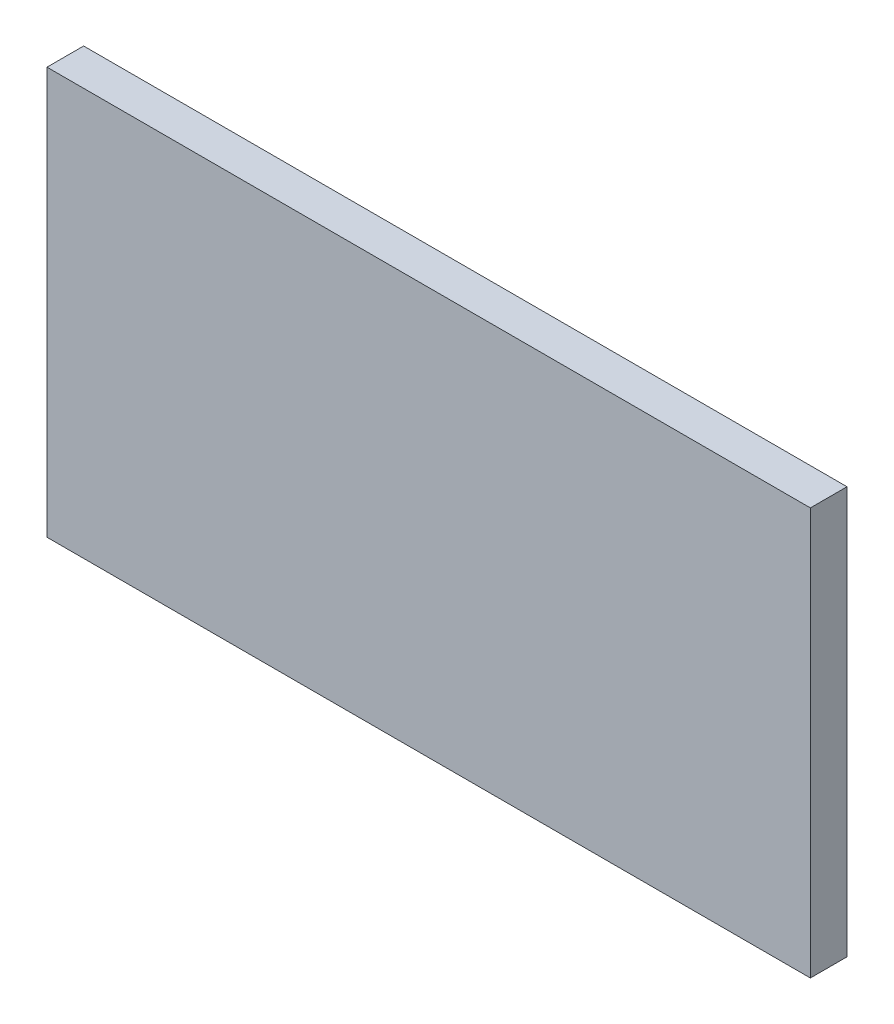
ISO-10303-21;
HEADER;
FILE_DESCRIPTION(('STEP AP214'),'2;1');
FILE_NAME('part.step','',(''),(''),'','','');
FILE_SCHEMA(('AUTOMOTIVE_DESIGN { 1 0 10303 214 1 1 1 1 }'));
ENDSEC;
DATA;
#1=APPLICATION_CONTEXT('core data for automotive mechanical design processes');
#2=APPLICATION_PROTOCOL_DEFINITION('international standard','automotive_design',2000,#1);
#3=PRODUCT_CONTEXT('',#1,'mechanical');
#4=PRODUCT('Part','Part','',(#3));
#5=PRODUCT_RELATED_PRODUCT_CATEGORY('part','',(#4));
#6=PRODUCT_DEFINITION_FORMATION('','',#4);
#7=PRODUCT_DEFINITION_CONTEXT('part definition',#1,'design');
#8=PRODUCT_DEFINITION('design','',#6,#7);
#9=PRODUCT_DEFINITION_SHAPE('','',#8);
#10=(LENGTH_UNIT() NAMED_UNIT(*) SI_UNIT(.MILLI.,.METRE.));
#11=(NAMED_UNIT(*) PLANE_ANGLE_UNIT() SI_UNIT($,.RADIAN.));
#12=(NAMED_UNIT(*) SI_UNIT($,.STERADIAN.) SOLID_ANGLE_UNIT());
#13=UNCERTAINTY_MEASURE_WITH_UNIT(LENGTH_MEASURE(1.E-05),#10,'distance_accuracy_value','');
#14=(GEOMETRIC_REPRESENTATION_CONTEXT(3) GLOBAL_UNCERTAINTY_ASSIGNED_CONTEXT((#13)) GLOBAL_UNIT_ASSIGNED_CONTEXT((#10,
#11,#12)) REPRESENTATION_CONTEXT('',''));
#15=CARTESIAN_POINT('',(0.,0.,0.));
#16=DIRECTION('',(0.,0.,1.));
#17=DIRECTION('',(1.,0.,0.));
#18=AXIS2_PLACEMENT_3D('',#15,#16,#17);
#19=CARTESIAN_POINT('',(-187.5,250.,-187.5));
#20=DIRECTION('',(1.,0.,0.));
#21=DIRECTION('',(0.,0.,-1.));
#22=AXIS2_PLACEMENT_3D('',#19,#20,#21);
#23=PLANE('',#22);
#24=DIRECTION('',(0.,0.,1.));
#25=VECTOR('',#24,1.);
#26=CARTESIAN_POINT('',(-187.5,50.,-187.5));
#27=LINE('',#26,#25);
#28=CARTESIAN_POINT('',(-187.5,50.,-205.5));
#29=VERTEX_POINT('',#28);
#30=CARTESIAN_POINT('',(-187.5,50.,-187.5));
#31=VERTEX_POINT('',#30);
#32=EDGE_CURVE('E107',#29,#31,#27,.T.);
#33=ORIENTED_EDGE('',*,*,#32,.T.);
#34=DIRECTION('',(0.,-1.,0.));
#35=VECTOR('',#34,1.);
#36=CARTESIAN_POINT('',(-187.5,250.,-187.5));
#37=LINE('',#36,#35);
#38=CARTESIAN_POINT('',(-187.5,250.,-187.5));
#39=VERTEX_POINT('',#38);
#40=EDGE_CURVE('E11',#39,#31,#37,.T.);
#41=ORIENTED_EDGE('',*,*,#40,.F.);
#42=DIRECTION('',(0.,0.,1.));
#43=VECTOR('',#42,1.);
#44=CARTESIAN_POINT('',(-187.5,250.,-187.5));
#45=LINE('',#44,#43);
#46=CARTESIAN_POINT('',(-187.5,250.,-205.5));
#47=VERTEX_POINT('',#46);
#48=EDGE_CURVE('E91',#47,#39,#45,.T.);
#49=ORIENTED_EDGE('',*,*,#48,.F.);
#50=DIRECTION('',(0.,-1.,0.));
#51=VECTOR('',#50,1.);
#52=CARTESIAN_POINT('',(-187.5,250.,-205.5));
#53=LINE('',#52,#51);
#54=EDGE_CURVE('E103',#47,#29,#53,.T.);
#55=ORIENTED_EDGE('',*,*,#54,.T.);
#56=EDGE_LOOP('',(#33,#41,#49,#55));
#57=FACE_BOUND('',#56,.T.);
#58=ADVANCED_FACE('F39',(#57),#23,.F.);
#59=CARTESIAN_POINT('',(-187.5,250.,-187.5));
#60=DIRECTION('',(0.,0.,-1.));
#61=DIRECTION('',(-1.,0.,0.));
#62=AXIS2_PLACEMENT_3D('',#59,#60,#61);
#63=PLANE('',#62);
#64=DIRECTION('',(1.,0.,0.));
#65=VECTOR('',#64,1.);
#66=CARTESIAN_POINT('',(-187.5,50.,-187.5));
#67=LINE('',#66,#65);
#68=CARTESIAN_POINT('',(187.5,50.,-187.5));
#69=VERTEX_POINT('',#68);
#70=EDGE_CURVE('E96',#31,#69,#67,.T.);
#71=ORIENTED_EDGE('',*,*,#70,.T.);
#72=DIRECTION('',(0.,-1.,0.));
#73=VECTOR('',#72,1.);
#74=CARTESIAN_POINT('',(187.5,250.,-187.5));
#75=LINE('',#74,#73);
#76=CARTESIAN_POINT('',(187.5,250.,-187.5));
#77=VERTEX_POINT('',#76);
#78=EDGE_CURVE('E48',#77,#69,#75,.T.);
#79=ORIENTED_EDGE('',*,*,#78,.F.);
#80=DIRECTION('',(1.,0.,0.));
#81=VECTOR('',#80,1.);
#82=CARTESIAN_POINT('',(-187.5,250.,-187.5));
#83=LINE('',#82,#81);
#84=EDGE_CURVE('E86',#39,#77,#83,.T.);
#85=ORIENTED_EDGE('',*,*,#84,.F.);
#86=ORIENTED_EDGE('',*,*,#40,.T.);
#87=EDGE_LOOP('',(#71,#79,#85,#86));
#88=FACE_BOUND('',#87,.T.);
#89=ADVANCED_FACE('F95',(#88),#63,.F.);
#90=CARTESIAN_POINT('',(187.5,250.,-187.5));
#91=DIRECTION('',(-1.,0.,0.));
#92=DIRECTION('',(0.,0.,1.));
#93=AXIS2_PLACEMENT_3D('',#90,#91,#92);
#94=PLANE('',#93);
#95=DIRECTION('',(0.,0.,-1.));
#96=VECTOR('',#95,1.);
#97=CARTESIAN_POINT('',(187.5,50.,-187.5));
#98=LINE('',#97,#96);
#99=CARTESIAN_POINT('',(187.5,50.,-205.5));
#100=VERTEX_POINT('',#99);
#101=EDGE_CURVE('E73',#69,#100,#98,.T.);
#102=ORIENTED_EDGE('',*,*,#101,.T.);
#103=DIRECTION('',(0.,-1.,0.));
#104=VECTOR('',#103,1.);
#105=CARTESIAN_POINT('',(187.5,250.,-205.5));
#106=LINE('',#105,#104);
#107=CARTESIAN_POINT('',(187.5,250.,-205.5));
#108=VERTEX_POINT('',#107);
#109=EDGE_CURVE('E98',#108,#100,#106,.T.);
#110=ORIENTED_EDGE('',*,*,#109,.F.);
#111=DIRECTION('',(0.,0.,-1.));
#112=VECTOR('',#111,1.);
#113=CARTESIAN_POINT('',(187.5,250.,-187.5));
#114=LINE('',#113,#112);
#115=EDGE_CURVE('E89',#77,#108,#114,.T.);
#116=ORIENTED_EDGE('',*,*,#115,.F.);
#117=ORIENTED_EDGE('',*,*,#78,.T.);
#118=EDGE_LOOP('',(#102,#110,#116,#117));
#119=FACE_BOUND('',#118,.T.);
#120=ADVANCED_FACE('F99',(#119),#94,.F.);
#121=CARTESIAN_POINT('',(-187.5,250.,-205.5));
#122=DIRECTION('',(0.,0.,1.));
#123=DIRECTION('',(1.,0.,0.));
#124=AXIS2_PLACEMENT_3D('',#121,#122,#123);
#125=PLANE('',#124);
#126=DIRECTION('',(-1.,0.,0.));
#127=VECTOR('',#126,1.);
#128=CARTESIAN_POINT('',(-187.5,50.,-205.5));
#129=LINE('',#128,#127);
#130=EDGE_CURVE('E79',#100,#29,#129,.T.);
#131=ORIENTED_EDGE('',*,*,#130,.T.);
#132=ORIENTED_EDGE('',*,*,#54,.F.);
#133=DIRECTION('',(-1.,0.,0.));
#134=VECTOR('',#133,1.);
#135=CARTESIAN_POINT('',(-187.5,250.,-205.5));
#136=LINE('',#135,#134);
#137=EDGE_CURVE('E56',#108,#47,#136,.T.);
#138=ORIENTED_EDGE('',*,*,#137,.F.);
#139=ORIENTED_EDGE('',*,*,#109,.T.);
#140=EDGE_LOOP('',(#131,#132,#138,#139));
#141=FACE_BOUND('',#140,.T.);
#142=ADVANCED_FACE('F120',(#141),#125,.F.);
#143=CARTESIAN_POINT('',(0.,250.,0.));
#144=DIRECTION('',(0.,-1.,0.));
#145=DIRECTION('',(0.,0.,-1.));
#146=AXIS2_PLACEMENT_3D('',#143,#144,#145);
#147=PLANE('',#146);
#148=ORIENTED_EDGE('',*,*,#48,.T.);
#149=ORIENTED_EDGE('',*,*,#84,.T.);
#150=ORIENTED_EDGE('',*,*,#115,.T.);
#151=ORIENTED_EDGE('',*,*,#137,.T.);
#152=EDGE_LOOP('',(#148,#149,#150,#151));
#153=FACE_BOUND('',#152,.T.);
#154=ADVANCED_FACE('F87',(#153),#147,.F.);
#155=CARTESIAN_POINT('',(0.,50.,0.));
#156=DIRECTION('',(0.,-1.,0.));
#157=DIRECTION('',(0.,0.,-1.));
#158=AXIS2_PLACEMENT_3D('',#155,#156,#157);
#159=PLANE('',#158);
#160=ORIENTED_EDGE('',*,*,#32,.F.);
#161=ORIENTED_EDGE('',*,*,#130,.F.);
#162=ORIENTED_EDGE('',*,*,#101,.F.);
#163=ORIENTED_EDGE('',*,*,#70,.F.);
#164=EDGE_LOOP('',(#160,#161,#162,#163));
#165=FACE_BOUND('',#164,.T.);
#166=ADVANCED_FACE('F123',(#165),#159,.T.);
#167=CLOSED_SHELL('',(#58,#89,#120,#142,#154,#166));
#168=MANIFOLD_SOLID_BREP('B2',#167);
#169=ADVANCED_BREP_SHAPE_REPRESENTATION('',(#18,#168),#14);
#170=SHAPE_DEFINITION_REPRESENTATION(#9,#169);
ENDSEC;
END-ISO-10303-21;
